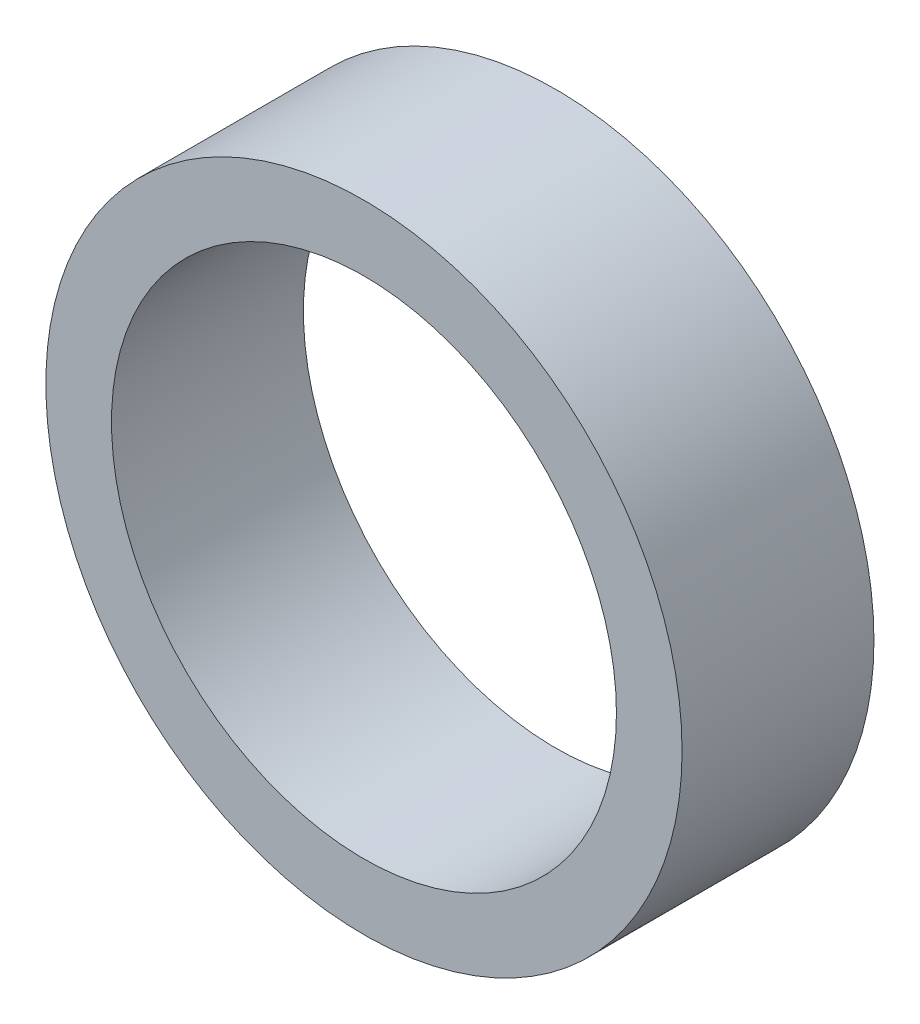
ISO-10303-21;
HEADER;
FILE_DESCRIPTION(('STEP AP214'),'2;1');
FILE_NAME('part.step','',(''),(''),'','','');
FILE_SCHEMA(('AUTOMOTIVE_DESIGN { 1 0 10303 214 1 1 1 1 }'));
ENDSEC;
DATA;
#1=APPLICATION_CONTEXT('core data for automotive mechanical design processes');
#2=APPLICATION_PROTOCOL_DEFINITION('international standard','automotive_design',2000,#1);
#3=PRODUCT_CONTEXT('',#1,'mechanical');
#4=PRODUCT('Part','Part','',(#3));
#5=PRODUCT_RELATED_PRODUCT_CATEGORY('part','',(#4));
#6=PRODUCT_DEFINITION_FORMATION('','',#4);
#7=PRODUCT_DEFINITION_CONTEXT('part definition',#1,'design');
#8=PRODUCT_DEFINITION('design','',#6,#7);
#9=PRODUCT_DEFINITION_SHAPE('','',#8);
#10=(LENGTH_UNIT() NAMED_UNIT(*) SI_UNIT(.MILLI.,.METRE.));
#11=(NAMED_UNIT(*) PLANE_ANGLE_UNIT() SI_UNIT($,.RADIAN.));
#12=(NAMED_UNIT(*) SI_UNIT($,.STERADIAN.) SOLID_ANGLE_UNIT());
#13=UNCERTAINTY_MEASURE_WITH_UNIT(LENGTH_MEASURE(1.E-05),#10,'distance_accuracy_value','');
#14=(GEOMETRIC_REPRESENTATION_CONTEXT(3) GLOBAL_UNCERTAINTY_ASSIGNED_CONTEXT((#13)) GLOBAL_UNIT_ASSIGNED_CONTEXT((#10,
#11,#12)) REPRESENTATION_CONTEXT('',''));
#15=CARTESIAN_POINT('',(0.,0.,0.));
#16=DIRECTION('',(0.,0.,1.));
#17=DIRECTION('',(1.,0.,0.));
#18=AXIS2_PLACEMENT_3D('',#15,#16,#17);
#19=CARTESIAN_POINT('',(0.,0.,-19.));
#20=DIRECTION('',(0.,0.,1.));
#21=DIRECTION('',(1.,0.,0.));
#22=AXIS2_PLACEMENT_3D('',#19,#20,#21);
#23=CYLINDRICAL_SURFACE('',#22,31.5);
#24=CARTESIAN_POINT('',(0.,0.,-19.));
#25=DIRECTION('',(0.,0.,1.));
#26=DIRECTION('',(1.,0.,0.));
#27=AXIS2_PLACEMENT_3D('',#24,#25,#26);
#28=CIRCLE('',#27,31.5);
#29=CARTESIAN_POINT('',(31.5,0.,-19.));
#30=VERTEX_POINT('',#29);
#31=EDGE_CURVE('E10',#30,#30,#28,.T.);
#32=ORIENTED_EDGE('',*,*,#31,.T.);
#33=EDGE_LOOP('',(#32));
#34=FACE_BOUND('',#33,.T.);
#35=CARTESIAN_POINT('',(0.,0.,0.));
#36=DIRECTION('',(0.,0.,1.));
#37=DIRECTION('',(1.,0.,0.));
#38=AXIS2_PLACEMENT_3D('',#35,#36,#37);
#39=CIRCLE('',#38,31.5);
#40=CARTESIAN_POINT('',(31.5,0.,0.));
#41=VERTEX_POINT('',#40);
#42=EDGE_CURVE('E31',#41,#41,#39,.T.);
#43=ORIENTED_EDGE('',*,*,#42,.F.);
#44=EDGE_LOOP('',(#43));
#45=FACE_BOUND('',#44,.T.);
#46=ADVANCED_FACE('F28',(#34,#45),#23,.T.);
#47=CARTESIAN_POINT('',(0.,0.,-19.));
#48=DIRECTION('',(0.,0.,1.));
#49=DIRECTION('',(1.,0.,0.));
#50=AXIS2_PLACEMENT_3D('',#47,#48,#49);
#51=PLANE('',#50);
#52=CARTESIAN_POINT('',(0.,0.,-19.));
#53=DIRECTION('',(0.,0.,1.));
#54=DIRECTION('',(1.,0.,0.));
#55=AXIS2_PLACEMENT_3D('',#52,#53,#54);
#56=CIRCLE('',#55,24.9999999999995);
#57=CARTESIAN_POINT('',(24.9999999999995,0.,-19.));
#58=VERTEX_POINT('',#57);
#59=EDGE_CURVE('E38',#58,#58,#56,.T.);
#60=ORIENTED_EDGE('',*,*,#59,.T.);
#61=EDGE_LOOP('',(#60));
#62=FACE_BOUND('',#61,.T.);
#63=ORIENTED_EDGE('',*,*,#31,.F.);
#64=EDGE_LOOP('',(#63));
#65=FACE_BOUND('',#64,.T.);
#66=ADVANCED_FACE('F46',(#62,#65),#51,.F.);
#67=CARTESIAN_POINT('',(0.,0.,0.));
#68=DIRECTION('',(0.,0.,1.));
#69=DIRECTION('',(1.,0.,0.));
#70=AXIS2_PLACEMENT_3D('',#67,#68,#69);
#71=PLANE('',#70);
#72=CARTESIAN_POINT('',(0.,0.,0.));
#73=DIRECTION('',(0.,0.,1.));
#74=DIRECTION('',(1.,0.,0.));
#75=AXIS2_PLACEMENT_3D('',#72,#73,#74);
#76=CIRCLE('',#75,24.9999999999995);
#77=CARTESIAN_POINT('',(24.9999999999995,0.,0.));
#78=VERTEX_POINT('',#77);
#79=EDGE_CURVE('E40',#78,#78,#76,.T.);
#80=ORIENTED_EDGE('',*,*,#79,.F.);
#81=EDGE_LOOP('',(#80));
#82=FACE_BOUND('',#81,.T.);
#83=ORIENTED_EDGE('',*,*,#42,.T.);
#84=EDGE_LOOP('',(#83));
#85=FACE_BOUND('',#84,.T.);
#86=ADVANCED_FACE('F52',(#82,#85),#71,.T.);
#87=CARTESIAN_POINT('',(0.,0.,-19.));
#88=DIRECTION('',(0.,0.,1.));
#89=DIRECTION('',(1.,0.,0.));
#90=AXIS2_PLACEMENT_3D('',#87,#88,#89);
#91=CYLINDRICAL_SURFACE('',#90,24.9999999999995);
#92=ORIENTED_EDGE('',*,*,#59,.F.);
#93=EDGE_LOOP('',(#92));
#94=FACE_BOUND('',#93,.T.);
#95=ORIENTED_EDGE('',*,*,#79,.T.);
#96=EDGE_LOOP('',(#95));
#97=FACE_BOUND('',#96,.T.);
#98=ADVANCED_FACE('F49',(#94,#97),#91,.F.);
#99=CLOSED_SHELL('',(#46,#66,#86,#98));
#100=MANIFOLD_SOLID_BREP('B2',#99);
#101=ADVANCED_BREP_SHAPE_REPRESENTATION('',(#18,#100),#14);
#102=SHAPE_DEFINITION_REPRESENTATION(#9,#101);
ENDSEC;
END-ISO-10303-21;
